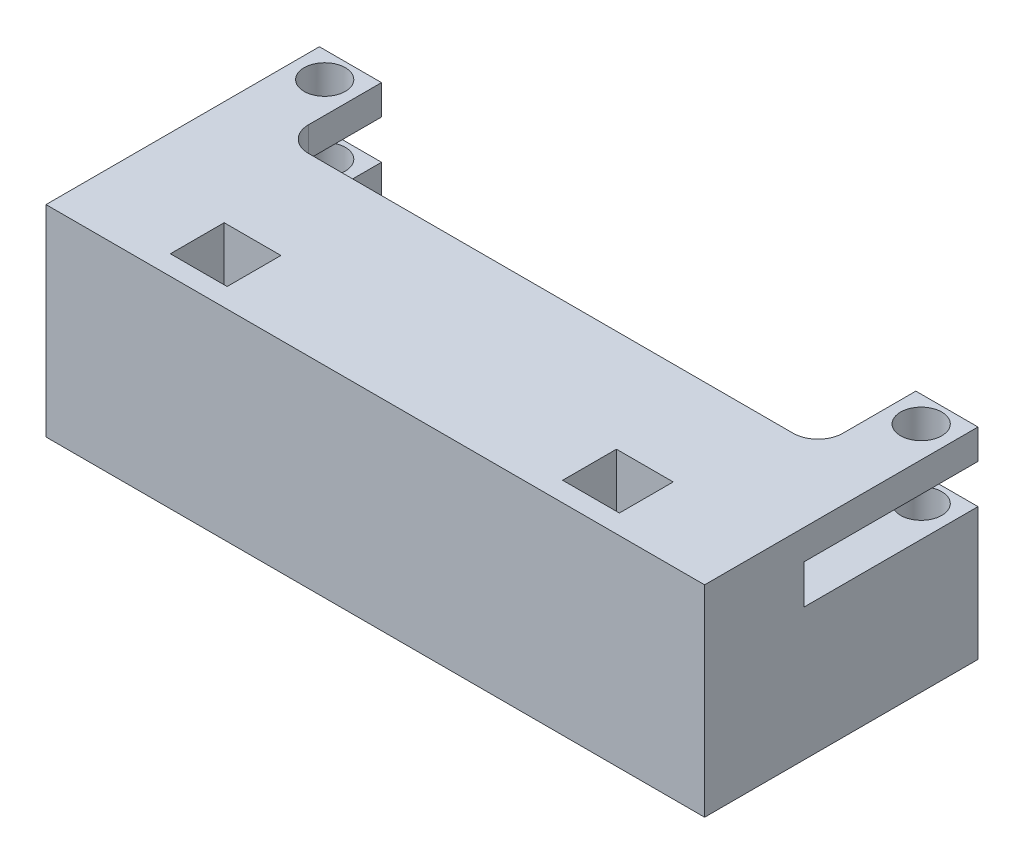
ISO-10303-21;
HEADER;
FILE_DESCRIPTION(('STEP AP214'),'2;1');
FILE_NAME('part.step','',(''),(''),'','','');
FILE_SCHEMA(('AUTOMOTIVE_DESIGN { 1 0 10303 214 1 1 1 1 }'));
ENDSEC;
DATA;
#1=APPLICATION_CONTEXT('core data for automotive mechanical design processes');
#2=APPLICATION_PROTOCOL_DEFINITION('international standard','automotive_design',2000,#1);
#3=PRODUCT_CONTEXT('',#1,'mechanical');
#4=PRODUCT('Part','Part','',(#3));
#5=PRODUCT_RELATED_PRODUCT_CATEGORY('part','',(#4));
#6=PRODUCT_DEFINITION_FORMATION('','',#4);
#7=PRODUCT_DEFINITION_CONTEXT('part definition',#1,'design');
#8=PRODUCT_DEFINITION('design','',#6,#7);
#9=PRODUCT_DEFINITION_SHAPE('','',#8);
#10=(LENGTH_UNIT() NAMED_UNIT(*) SI_UNIT(.MILLI.,.METRE.));
#11=(NAMED_UNIT(*) PLANE_ANGLE_UNIT() SI_UNIT($,.RADIAN.));
#12=(NAMED_UNIT(*) SI_UNIT($,.STERADIAN.) SOLID_ANGLE_UNIT());
#13=UNCERTAINTY_MEASURE_WITH_UNIT(LENGTH_MEASURE(1.E-05),#10,'distance_accuracy_value','');
#14=(GEOMETRIC_REPRESENTATION_CONTEXT(3) GLOBAL_UNCERTAINTY_ASSIGNED_CONTEXT((#13)) GLOBAL_UNIT_ASSIGNED_CONTEXT((#10,
#11,#12)) REPRESENTATION_CONTEXT('',''));
#15=CARTESIAN_POINT('',(0.,0.,0.));
#16=DIRECTION('',(0.,0.,1.));
#17=DIRECTION('',(1.,0.,0.));
#18=AXIS2_PLACEMENT_3D('',#15,#16,#17);
#19=CARTESIAN_POINT('',(33.655,20.574,-13.97));
#20=DIRECTION('',(0.,0.,1.));
#21=DIRECTION('',(1.,0.,0.));
#22=AXIS2_PLACEMENT_3D('',#19,#20,#21);
#23=PLANE('',#22);
#24=DIRECTION('',(-1.,0.,0.));
#25=VECTOR('',#24,1.);
#26=CARTESIAN_POINT('',(33.655,13.526,-13.97));
#27=LINE('',#26,#25);
#28=CARTESIAN_POINT('',(33.655,13.526,-13.97));
#29=VERTEX_POINT('',#28);
#30=CARTESIAN_POINT('',(27.305,13.526,-13.97));
#31=VERTEX_POINT('',#30);
#32=EDGE_CURVE('E411',#29,#31,#27,.T.);
#33=ORIENTED_EDGE('',*,*,#32,.F.);
#34=DIRECTION('',(0.,-1.,0.));
#35=VECTOR('',#34,1.);
#36=CARTESIAN_POINT('',(33.655,20.574,-13.97));
#37=LINE('',#36,#35);
#38=CARTESIAN_POINT('',(33.655,0.,-13.97));
#39=VERTEX_POINT('',#38);
#40=EDGE_CURVE('E447',#29,#39,#37,.T.);
#41=ORIENTED_EDGE('',*,*,#40,.T.);
#42=DIRECTION('',(-1.,0.,0.));
#43=VECTOR('',#42,1.);
#44=CARTESIAN_POINT('',(33.655,0.,-13.97));
#45=LINE('',#44,#43);
#46=CARTESIAN_POINT('',(27.305,0.,-13.97));
#47=VERTEX_POINT('',#46);
#48=EDGE_CURVE('E414',#39,#47,#45,.T.);
#49=ORIENTED_EDGE('',*,*,#48,.T.);
#50=DIRECTION('',(0.,-1.,0.));
#51=VECTOR('',#50,1.);
#52=CARTESIAN_POINT('',(27.305,20.574,-13.97));
#53=LINE('',#52,#51);
#54=EDGE_CURVE('E48',#31,#47,#53,.T.);
#55=ORIENTED_EDGE('',*,*,#54,.F.);
#56=EDGE_LOOP('',(#33,#41,#49,#55));
#57=FACE_BOUND('',#56,.T.);
#58=ADVANCED_FACE('F39',(#57),#23,.F.);
#59=DIRECTION('',(1.,0.,0.));
#60=VECTOR('',#59,1.);
#61=CARTESIAN_POINT('',(33.655,17.526,-13.97));
#62=LINE('',#61,#60);
#63=CARTESIAN_POINT('',(27.305,17.526,-13.97));
#64=VERTEX_POINT('',#63);
#65=CARTESIAN_POINT('',(33.655,17.526,-13.97));
#66=VERTEX_POINT('',#65);
#67=EDGE_CURVE('E390',#64,#66,#62,.T.);
#68=ORIENTED_EDGE('',*,*,#67,.F.);
#69=CARTESIAN_POINT('',(27.305,20.574,-13.97));
#70=VERTEX_POINT('',#69);
#71=EDGE_CURVE('E11',#70,#64,#53,.T.);
#72=ORIENTED_EDGE('',*,*,#71,.F.);
#73=DIRECTION('',(-1.,0.,0.));
#74=VECTOR('',#73,1.);
#75=CARTESIAN_POINT('',(33.655,20.574,-13.97));
#76=LINE('',#75,#74);
#77=CARTESIAN_POINT('',(33.655,20.574,-13.97));
#78=VERTEX_POINT('',#77);
#79=EDGE_CURVE('E415',#78,#70,#76,.T.);
#80=ORIENTED_EDGE('',*,*,#79,.F.);
#81=EDGE_CURVE('E484',#78,#66,#37,.T.);
#82=ORIENTED_EDGE('',*,*,#81,.T.);
#83=EDGE_LOOP('',(#68,#72,#80,#82));
#84=FACE_BOUND('',#83,.T.);
#85=ADVANCED_FACE('F551',(#84),#23,.F.);
#86=CARTESIAN_POINT('',(27.305,20.574,-6.51000000000001));
#87=DIRECTION('',(1.,0.,0.));
#88=DIRECTION('',(0.,0.,-1.));
#89=AXIS2_PLACEMENT_3D('',#86,#87,#88);
#90=PLANE('',#89);
#91=DIRECTION('',(0.,0.,1.));
#92=VECTOR('',#91,1.);
#93=CARTESIAN_POINT('',(27.305,13.526,-6.51000000000001));
#94=LINE('',#93,#92);
#95=CARTESIAN_POINT('',(27.305,13.526,-6.51000000000001));
#96=VERTEX_POINT('',#95);
#97=EDGE_CURVE('E408',#31,#96,#94,.T.);
#98=ORIENTED_EDGE('',*,*,#97,.F.);
#99=ORIENTED_EDGE('',*,*,#54,.T.);
#100=DIRECTION('',(0.,0.,1.));
#101=VECTOR('',#100,1.);
#102=CARTESIAN_POINT('',(27.305,0.,-6.51000000000001));
#103=LINE('',#102,#101);
#104=CARTESIAN_POINT('',(27.305,0.,-6.51000000000001));
#105=VERTEX_POINT('',#104);
#106=EDGE_CURVE('E451',#47,#105,#103,.T.);
#107=ORIENTED_EDGE('',*,*,#106,.T.);
#108=DIRECTION('',(0.,-1.,0.));
#109=VECTOR('',#108,1.);
#110=CARTESIAN_POINT('',(27.305,20.574,-6.51000000000001));
#111=LINE('',#110,#109);
#112=EDGE_CURVE('E521',#96,#105,#111,.T.);
#113=ORIENTED_EDGE('',*,*,#112,.F.);
#114=EDGE_LOOP('',(#98,#99,#107,#113));
#115=FACE_BOUND('',#114,.T.);
#116=ADVANCED_FACE('F601',(#115),#90,.F.);
#117=DIRECTION('',(0.,0.,-1.));
#118=VECTOR('',#117,1.);
#119=CARTESIAN_POINT('',(27.305,17.526,-6.51000000000001));
#120=LINE('',#119,#118);
#121=CARTESIAN_POINT('',(27.305,17.526,-6.51000000000001));
#122=VERTEX_POINT('',#121);
#123=EDGE_CURVE('E387',#122,#64,#120,.T.);
#124=ORIENTED_EDGE('',*,*,#123,.F.);
#125=CARTESIAN_POINT('',(27.305,20.574,-6.51000000000001));
#126=VERTEX_POINT('',#125);
#127=EDGE_CURVE('E522',#126,#122,#111,.T.);
#128=ORIENTED_EDGE('',*,*,#127,.F.);
#129=DIRECTION('',(0.,0.,1.));
#130=VECTOR('',#129,1.);
#131=CARTESIAN_POINT('',(27.305,20.574,-6.51000000000001));
#132=LINE('',#131,#130);
#133=EDGE_CURVE('E419',#70,#126,#132,.T.);
#134=ORIENTED_EDGE('',*,*,#133,.F.);
#135=ORIENTED_EDGE('',*,*,#71,.T.);
#136=EDGE_LOOP('',(#124,#128,#134,#135));
#137=FACE_BOUND('',#136,.T.);
#138=ADVANCED_FACE('F605',(#137),#90,.F.);
#139=CARTESIAN_POINT('',(24.765,20.574,-6.51000000000001));
#140=DIRECTION('',(0.,-1.,0.));
#141=DIRECTION('',(0.,0.,-1.));
#142=AXIS2_PLACEMENT_3D('',#139,#140,#141);
#143=CYLINDRICAL_SURFACE('',#142,2.54);
#144=CARTESIAN_POINT('',(24.765,13.526,-6.51000000000001));
#145=DIRECTION('',(0.,1.,0.));
#146=DIRECTION('',(0.,0.,1.));
#147=AXIS2_PLACEMENT_3D('',#144,#145,#146);
#148=CIRCLE('',#147,2.54);
#149=CARTESIAN_POINT('',(24.765,13.526,-3.97));
#150=VERTEX_POINT('',#149);
#151=EDGE_CURVE('E405',#96,#150,#148,.F.);
#152=ORIENTED_EDGE('',*,*,#151,.F.);
#153=ORIENTED_EDGE('',*,*,#112,.T.);
#154=CARTESIAN_POINT('',(24.765,0.,-6.51000000000001));
#155=DIRECTION('',(0.,-1.,0.));
#156=DIRECTION('',(0.,0.,1.));
#157=AXIS2_PLACEMENT_3D('',#154,#155,#156);
#158=CIRCLE('',#157,2.54);
#159=CARTESIAN_POINT('',(24.765,0.,-3.97));
#160=VERTEX_POINT('',#159);
#161=EDGE_CURVE('E455',#105,#160,#158,.T.);
#162=ORIENTED_EDGE('',*,*,#161,.T.);
#163=DIRECTION('',(0.,-1.,0.));
#164=VECTOR('',#163,1.);
#165=CARTESIAN_POINT('',(24.765,20.574,-3.97));
#166=LINE('',#165,#164);
#167=EDGE_CURVE('E516',#150,#160,#166,.T.);
#168=ORIENTED_EDGE('',*,*,#167,.F.);
#169=EDGE_LOOP('',(#152,#153,#162,#168));
#170=FACE_BOUND('',#169,.T.);
#171=ADVANCED_FACE('F610',(#170),#143,.F.);
#172=CARTESIAN_POINT('',(24.765,17.526,-6.51000000000001));
#173=DIRECTION('',(0.,-1.,0.));
#174=DIRECTION('',(0.,0.,-1.));
#175=AXIS2_PLACEMENT_3D('',#172,#173,#174);
#176=CIRCLE('',#175,2.54);
#177=CARTESIAN_POINT('',(24.765,17.526,-3.97));
#178=VERTEX_POINT('',#177);
#179=EDGE_CURVE('E384',#178,#122,#176,.F.);
#180=ORIENTED_EDGE('',*,*,#179,.F.);
#181=CARTESIAN_POINT('',(24.765,20.574,-3.97));
#182=VERTEX_POINT('',#181);
#183=EDGE_CURVE('E517',#182,#178,#166,.T.);
#184=ORIENTED_EDGE('',*,*,#183,.F.);
#185=CARTESIAN_POINT('',(24.765,20.574,-6.51000000000001));
#186=DIRECTION('',(0.,-1.,0.));
#187=DIRECTION('',(0.,0.,1.));
#188=AXIS2_PLACEMENT_3D('',#185,#186,#187);
#189=CIRCLE('',#188,2.54);
#190=EDGE_CURVE('E423',#126,#182,#189,.T.);
#191=ORIENTED_EDGE('',*,*,#190,.F.);
#192=ORIENTED_EDGE('',*,*,#127,.T.);
#193=EDGE_LOOP('',(#180,#184,#191,#192));
#194=FACE_BOUND('',#193,.T.);
#195=ADVANCED_FACE('F616',(#194),#143,.F.);
#196=CARTESIAN_POINT('',(-24.765,20.574,-3.97));
#197=DIRECTION('',(0.,0.,1.));
#198=DIRECTION('',(1.,0.,0.));
#199=AXIS2_PLACEMENT_3D('',#196,#197,#198);
#200=PLANE('',#199);
#201=DIRECTION('',(-1.,0.,0.));
#202=VECTOR('',#201,1.);
#203=CARTESIAN_POINT('',(-24.765,13.526,-3.97));
#204=LINE('',#203,#202);
#205=CARTESIAN_POINT('',(-24.765,13.526,-3.97));
#206=VERTEX_POINT('',#205);
#207=EDGE_CURVE('E402',#150,#206,#204,.T.);
#208=ORIENTED_EDGE('',*,*,#207,.F.);
#209=ORIENTED_EDGE('',*,*,#167,.T.);
#210=DIRECTION('',(-1.,0.,0.));
#211=VECTOR('',#210,1.);
#212=CARTESIAN_POINT('',(-24.765,0.,-3.97));
#213=LINE('',#212,#211);
#214=CARTESIAN_POINT('',(-24.765,0.,-3.97));
#215=VERTEX_POINT('',#214);
#216=EDGE_CURVE('E459',#160,#215,#213,.T.);
#217=ORIENTED_EDGE('',*,*,#216,.T.);
#218=DIRECTION('',(0.,-1.,0.));
#219=VECTOR('',#218,1.);
#220=CARTESIAN_POINT('',(-24.765,20.574,-3.97));
#221=LINE('',#220,#219);
#222=EDGE_CURVE('E511',#206,#215,#221,.T.);
#223=ORIENTED_EDGE('',*,*,#222,.F.);
#224=EDGE_LOOP('',(#208,#209,#217,#223));
#225=FACE_BOUND('',#224,.T.);
#226=ADVANCED_FACE('F618',(#225),#200,.F.);
#227=DIRECTION('',(1.,0.,0.));
#228=VECTOR('',#227,1.);
#229=CARTESIAN_POINT('',(-24.765,17.526,-3.97));
#230=LINE('',#229,#228);
#231=CARTESIAN_POINT('',(-24.765,17.526,-3.97));
#232=VERTEX_POINT('',#231);
#233=EDGE_CURVE('E381',#232,#178,#230,.T.);
#234=ORIENTED_EDGE('',*,*,#233,.F.);
#235=CARTESIAN_POINT('',(-24.765,20.574,-3.97));
#236=VERTEX_POINT('',#235);
#237=EDGE_CURVE('E512',#236,#232,#221,.T.);
#238=ORIENTED_EDGE('',*,*,#237,.F.);
#239=DIRECTION('',(-1.,0.,0.));
#240=VECTOR('',#239,1.);
#241=CARTESIAN_POINT('',(-24.765,20.574,-3.97));
#242=LINE('',#241,#240);
#243=EDGE_CURVE('E426',#182,#236,#242,.T.);
#244=ORIENTED_EDGE('',*,*,#243,.F.);
#245=ORIENTED_EDGE('',*,*,#183,.T.);
#246=EDGE_LOOP('',(#234,#238,#244,#245));
#247=FACE_BOUND('',#246,.T.);
#248=ADVANCED_FACE('F621',(#247),#200,.F.);
#249=CARTESIAN_POINT('',(-24.765,20.574,-6.51000000000001));
#250=DIRECTION('',(0.,-1.,0.));
#251=DIRECTION('',(0.,0.,-1.));
#252=AXIS2_PLACEMENT_3D('',#249,#250,#251);
#253=CYLINDRICAL_SURFACE('',#252,2.54);
#254=CARTESIAN_POINT('',(-24.765,13.526,-6.51000000000001));
#255=DIRECTION('',(0.,1.,0.));
#256=DIRECTION('',(0.,0.,1.));
#257=AXIS2_PLACEMENT_3D('',#254,#255,#256);
#258=CIRCLE('',#257,2.54);
#259=CARTESIAN_POINT('',(-27.305,13.526,-6.51000000000001));
#260=VERTEX_POINT('',#259);
#261=EDGE_CURVE('E399',#206,#260,#258,.F.);
#262=ORIENTED_EDGE('',*,*,#261,.F.);
#263=ORIENTED_EDGE('',*,*,#222,.T.);
#264=CARTESIAN_POINT('',(-24.765,0.,-6.51000000000001));
#265=DIRECTION('',(0.,-1.,0.));
#266=DIRECTION('',(0.,0.,1.));
#267=AXIS2_PLACEMENT_3D('',#264,#265,#266);
#268=CIRCLE('',#267,2.54);
#269=CARTESIAN_POINT('',(-27.305,0.,-6.51000000000001));
#270=VERTEX_POINT('',#269);
#271=EDGE_CURVE('E463',#215,#270,#268,.T.);
#272=ORIENTED_EDGE('',*,*,#271,.T.);
#273=DIRECTION('',(0.,-1.,0.));
#274=VECTOR('',#273,1.);
#275=CARTESIAN_POINT('',(-27.305,20.574,-6.51000000000001));
#276=LINE('',#275,#274);
#277=EDGE_CURVE('E506',#260,#270,#276,.T.);
#278=ORIENTED_EDGE('',*,*,#277,.F.);
#279=EDGE_LOOP('',(#262,#263,#272,#278));
#280=FACE_BOUND('',#279,.T.);
#281=ADVANCED_FACE('F623',(#280),#253,.F.);
#282=CARTESIAN_POINT('',(-24.765,17.526,-6.51000000000001));
#283=DIRECTION('',(0.,-1.,0.));
#284=DIRECTION('',(0.,0.,-1.));
#285=AXIS2_PLACEMENT_3D('',#282,#283,#284);
#286=CIRCLE('',#285,2.54);
#287=CARTESIAN_POINT('',(-27.305,17.526,-6.51000000000001));
#288=VERTEX_POINT('',#287);
#289=EDGE_CURVE('E378',#288,#232,#286,.F.);
#290=ORIENTED_EDGE('',*,*,#289,.F.);
#291=CARTESIAN_POINT('',(-27.305,20.574,-6.51000000000001));
#292=VERTEX_POINT('',#291);
#293=EDGE_CURVE('E507',#292,#288,#276,.T.);
#294=ORIENTED_EDGE('',*,*,#293,.F.);
#295=CARTESIAN_POINT('',(-24.765,20.574,-6.51000000000001));
#296=DIRECTION('',(0.,-1.,0.));
#297=DIRECTION('',(0.,0.,1.));
#298=AXIS2_PLACEMENT_3D('',#295,#296,#297);
#299=CIRCLE('',#298,2.54);
#300=EDGE_CURVE('E429',#236,#292,#299,.T.);
#301=ORIENTED_EDGE('',*,*,#300,.F.);
#302=ORIENTED_EDGE('',*,*,#237,.T.);
#303=EDGE_LOOP('',(#290,#294,#301,#302));
#304=FACE_BOUND('',#303,.T.);
#305=ADVANCED_FACE('F626',(#304),#253,.F.);
#306=CARTESIAN_POINT('',(-27.305,20.574,-13.97));
#307=DIRECTION('',(-1.,0.,0.));
#308=DIRECTION('',(0.,0.,1.));
#309=AXIS2_PLACEMENT_3D('',#306,#307,#308);
#310=PLANE('',#309);
#311=DIRECTION('',(0.,0.,-1.));
#312=VECTOR('',#311,1.);
#313=CARTESIAN_POINT('',(-27.305,13.526,-13.97));
#314=LINE('',#313,#312);
#315=CARTESIAN_POINT('',(-27.305,13.526,-13.97));
#316=VERTEX_POINT('',#315);
#317=EDGE_CURVE('E396',#260,#316,#314,.T.);
#318=ORIENTED_EDGE('',*,*,#317,.F.);
#319=ORIENTED_EDGE('',*,*,#277,.T.);
#320=DIRECTION('',(0.,0.,-1.));
#321=VECTOR('',#320,1.);
#322=CARTESIAN_POINT('',(-27.305,0.,-13.97));
#323=LINE('',#322,#321);
#324=CARTESIAN_POINT('',(-27.305,0.,-13.97));
#325=VERTEX_POINT('',#324);
#326=EDGE_CURVE('E467',#270,#325,#323,.T.);
#327=ORIENTED_EDGE('',*,*,#326,.T.);
#328=DIRECTION('',(0.,-1.,0.));
#329=VECTOR('',#328,1.);
#330=CARTESIAN_POINT('',(-27.305,20.574,-13.97));
#331=LINE('',#330,#329);
#332=EDGE_CURVE('E501',#316,#325,#331,.T.);
#333=ORIENTED_EDGE('',*,*,#332,.F.);
#334=EDGE_LOOP('',(#318,#319,#327,#333));
#335=FACE_BOUND('',#334,.T.);
#336=ADVANCED_FACE('F628',(#335),#310,.F.);
#337=DIRECTION('',(0.,0.,1.));
#338=VECTOR('',#337,1.);
#339=CARTESIAN_POINT('',(-27.305,17.526,-13.97));
#340=LINE('',#339,#338);
#341=CARTESIAN_POINT('',(-27.305,17.526,-13.97));
#342=VERTEX_POINT('',#341);
#343=EDGE_CURVE('E375',#342,#288,#340,.T.);
#344=ORIENTED_EDGE('',*,*,#343,.F.);
#345=CARTESIAN_POINT('',(-27.305,20.574,-13.97));
#346=VERTEX_POINT('',#345);
#347=EDGE_CURVE('E502',#346,#342,#331,.T.);
#348=ORIENTED_EDGE('',*,*,#347,.F.);
#349=DIRECTION('',(0.,0.,-1.));
#350=VECTOR('',#349,1.);
#351=CARTESIAN_POINT('',(-27.305,20.574,-13.97));
#352=LINE('',#351,#350);
#353=EDGE_CURVE('E432',#292,#346,#352,.T.);
#354=ORIENTED_EDGE('',*,*,#353,.F.);
#355=ORIENTED_EDGE('',*,*,#293,.T.);
#356=EDGE_LOOP('',(#344,#348,#354,#355));
#357=FACE_BOUND('',#356,.T.);
#358=ADVANCED_FACE('F631',(#357),#310,.F.);
#359=CARTESIAN_POINT('',(-33.655,20.574,-13.97));
#360=DIRECTION('',(0.,0.,1.));
#361=DIRECTION('',(1.,0.,0.));
#362=AXIS2_PLACEMENT_3D('',#359,#360,#361);
#363=PLANE('',#362);
#364=DIRECTION('',(-1.,0.,0.));
#365=VECTOR('',#364,1.);
#366=CARTESIAN_POINT('',(-33.655,13.526,-13.97));
#367=LINE('',#366,#365);
#368=CARTESIAN_POINT('',(-33.655,13.526,-13.97));
#369=VERTEX_POINT('',#368);
#370=EDGE_CURVE('E393',#316,#369,#367,.T.);
#371=ORIENTED_EDGE('',*,*,#370,.F.);
#372=ORIENTED_EDGE('',*,*,#332,.T.);
#373=DIRECTION('',(-1.,0.,0.));
#374=VECTOR('',#373,1.);
#375=CARTESIAN_POINT('',(-33.655,0.,-13.97));
#376=LINE('',#375,#374);
#377=CARTESIAN_POINT('',(-33.655,0.,-13.97));
#378=VERTEX_POINT('',#377);
#379=EDGE_CURVE('E471',#325,#378,#376,.T.);
#380=ORIENTED_EDGE('',*,*,#379,.T.);
#381=DIRECTION('',(0.,-1.,0.));
#382=VECTOR('',#381,1.);
#383=CARTESIAN_POINT('',(-33.655,20.574,-13.97));
#384=LINE('',#383,#382);
#385=EDGE_CURVE('E496',#369,#378,#384,.T.);
#386=ORIENTED_EDGE('',*,*,#385,.F.);
#387=EDGE_LOOP('',(#371,#372,#380,#386));
#388=FACE_BOUND('',#387,.T.);
#389=ADVANCED_FACE('F633',(#388),#363,.F.);
#390=DIRECTION('',(1.,0.,0.));
#391=VECTOR('',#390,1.);
#392=CARTESIAN_POINT('',(-33.655,17.526,-13.97));
#393=LINE('',#392,#391);
#394=CARTESIAN_POINT('',(-33.655,17.526,-13.97));
#395=VERTEX_POINT('',#394);
#396=EDGE_CURVE('E372',#395,#342,#393,.T.);
#397=ORIENTED_EDGE('',*,*,#396,.F.);
#398=CARTESIAN_POINT('',(-33.655,20.574,-13.97));
#399=VERTEX_POINT('',#398);
#400=EDGE_CURVE('E497',#399,#395,#384,.T.);
#401=ORIENTED_EDGE('',*,*,#400,.F.);
#402=DIRECTION('',(-1.,0.,0.));
#403=VECTOR('',#402,1.);
#404=CARTESIAN_POINT('',(-33.655,20.574,-13.97));
#405=LINE('',#404,#403);
#406=EDGE_CURVE('E435',#346,#399,#405,.T.);
#407=ORIENTED_EDGE('',*,*,#406,.F.);
#408=ORIENTED_EDGE('',*,*,#347,.T.);
#409=EDGE_LOOP('',(#397,#401,#407,#408));
#410=FACE_BOUND('',#409,.T.);
#411=ADVANCED_FACE('F636',(#410),#363,.F.);
#412=CARTESIAN_POINT('',(-33.655,20.574,13.97));
#413=DIRECTION('',(1.,0.,0.));
#414=DIRECTION('',(0.,0.,-1.));
#415=AXIS2_PLACEMENT_3D('',#412,#413,#414);
#416=PLANE('',#415);
#417=DIRECTION('',(0.,0.,-1.));
#418=VECTOR('',#417,1.);
#419=CARTESIAN_POINT('',(-33.655,13.526,3.81));
#420=LINE('',#419,#418);
#421=CARTESIAN_POINT('',(-33.655,13.526,3.81));
#422=VERTEX_POINT('',#421);
#423=EDGE_CURVE('E368',#422,#369,#420,.T.);
#424=ORIENTED_EDGE('',*,*,#423,.T.);
#425=ORIENTED_EDGE('',*,*,#385,.T.);
#426=DIRECTION('',(0.,0.,1.));
#427=VECTOR('',#426,1.);
#428=CARTESIAN_POINT('',(-33.655,0.,13.97));
#429=LINE('',#428,#427);
#430=CARTESIAN_POINT('',(-33.655,0.,13.97));
#431=VERTEX_POINT('',#430);
#432=EDGE_CURVE('E475',#378,#431,#429,.T.);
#433=ORIENTED_EDGE('',*,*,#432,.T.);
#434=DIRECTION('',(0.,-1.,0.));
#435=VECTOR('',#434,1.);
#436=CARTESIAN_POINT('',(-33.655,20.574,13.97));
#437=LINE('',#436,#435);
#438=CARTESIAN_POINT('',(-33.655,20.574,13.97));
#439=VERTEX_POINT('',#438);
#440=EDGE_CURVE('E492',#439,#431,#437,.T.);
#441=ORIENTED_EDGE('',*,*,#440,.F.);
#442=DIRECTION('',(0.,0.,1.));
#443=VECTOR('',#442,1.);
#444=CARTESIAN_POINT('',(-33.655,20.574,13.97));
#445=LINE('',#444,#443);
#446=EDGE_CURVE('E438',#399,#439,#445,.T.);
#447=ORIENTED_EDGE('',*,*,#446,.F.);
#448=ORIENTED_EDGE('',*,*,#400,.T.);
#449=DIRECTION('',(0.,0.,-1.));
#450=VECTOR('',#449,1.);
#451=CARTESIAN_POINT('',(-33.655,17.526,3.81));
#452=LINE('',#451,#450);
#453=CARTESIAN_POINT('',(-33.655,17.526,3.81));
#454=VERTEX_POINT('',#453);
#455=EDGE_CURVE('E358',#454,#395,#452,.T.);
#456=ORIENTED_EDGE('',*,*,#455,.F.);
#457=DIRECTION('',(0.,-1.,0.));
#458=VECTOR('',#457,1.);
#459=CARTESIAN_POINT('',(-33.655,13.526,3.81));
#460=LINE('',#459,#458);
#461=EDGE_CURVE('E344',#454,#422,#460,.T.);
#462=ORIENTED_EDGE('',*,*,#461,.T.);
#463=EDGE_LOOP('',(#424,#425,#433,#441,#447,#448,#456,#462));
#464=FACE_BOUND('',#463,.T.);
#465=ADVANCED_FACE('F638',(#464),#416,.F.);
#466=CARTESIAN_POINT('',(33.655,20.574,13.97));
#467=DIRECTION('',(-1.,0.,0.));
#468=DIRECTION('',(0.,0.,1.));
#469=AXIS2_PLACEMENT_3D('',#466,#467,#468);
#470=PLANE('',#469);
#471=DIRECTION('',(0.,0.,-1.));
#472=VECTOR('',#471,1.);
#473=CARTESIAN_POINT('',(33.655,13.526,3.81));
#474=LINE('',#473,#472);
#475=CARTESIAN_POINT('',(33.655,13.526,3.81));
#476=VERTEX_POINT('',#475);
#477=EDGE_CURVE('E365',#476,#29,#474,.T.);
#478=ORIENTED_EDGE('',*,*,#477,.F.);
#479=DIRECTION('',(0.,1.,0.));
#480=VECTOR('',#479,1.);
#481=CARTESIAN_POINT('',(33.655,13.526,3.81));
#482=LINE('',#481,#480);
#483=CARTESIAN_POINT('',(33.655,17.526,3.81));
#484=VERTEX_POINT('',#483);
#485=EDGE_CURVE('E351',#476,#484,#482,.T.);
#486=ORIENTED_EDGE('',*,*,#485,.T.);
#487=DIRECTION('',(0.,0.,-1.));
#488=VECTOR('',#487,1.);
#489=CARTESIAN_POINT('',(33.655,17.526,3.81));
#490=LINE('',#489,#488);
#491=EDGE_CURVE('E361',#484,#66,#490,.T.);
#492=ORIENTED_EDGE('',*,*,#491,.T.);
#493=ORIENTED_EDGE('',*,*,#81,.F.);
#494=DIRECTION('',(0.,0.,-1.));
#495=VECTOR('',#494,1.);
#496=CARTESIAN_POINT('',(33.655,20.574,13.97));
#497=LINE('',#496,#495);
#498=CARTESIAN_POINT('',(33.655,20.574,13.97));
#499=VERTEX_POINT('',#498);
#500=EDGE_CURVE('E444',#499,#78,#497,.T.);
#501=ORIENTED_EDGE('',*,*,#500,.F.);
#502=DIRECTION('',(0.,-1.,0.));
#503=VECTOR('',#502,1.);
#504=CARTESIAN_POINT('',(33.655,20.574,13.97));
#505=LINE('',#504,#503);
#506=CARTESIAN_POINT('',(33.655,0.,13.97));
#507=VERTEX_POINT('',#506);
#508=EDGE_CURVE('E488',#499,#507,#505,.T.);
#509=ORIENTED_EDGE('',*,*,#508,.T.);
#510=DIRECTION('',(0.,0.,-1.));
#511=VECTOR('',#510,1.);
#512=CARTESIAN_POINT('',(33.655,0.,13.97));
#513=LINE('',#512,#511);
#514=EDGE_CURVE('E420',#507,#39,#513,.T.);
#515=ORIENTED_EDGE('',*,*,#514,.T.);
#516=ORIENTED_EDGE('',*,*,#40,.F.);
#517=EDGE_LOOP('',(#478,#486,#492,#493,#501,#509,#515,#516));
#518=FACE_BOUND('',#517,.T.);
#519=ADVANCED_FACE('F547',(#518),#470,.F.);
#520=CARTESIAN_POINT('',(-33.655,20.574,13.97));
#521=DIRECTION('',(0.,0.,-1.));
#522=DIRECTION('',(-1.,0.,0.));
#523=AXIS2_PLACEMENT_3D('',#520,#521,#522);
#524=PLANE('',#523);
#525=DIRECTION('',(1.,0.,0.));
#526=VECTOR('',#525,1.);
#527=CARTESIAN_POINT('',(-33.655,0.,13.97));
#528=LINE('',#527,#526);
#529=EDGE_CURVE('E478',#431,#507,#528,.T.);
#530=ORIENTED_EDGE('',*,*,#529,.T.);
#531=ORIENTED_EDGE('',*,*,#508,.F.);
#532=DIRECTION('',(1.,0.,0.));
#533=VECTOR('',#532,1.);
#534=CARTESIAN_POINT('',(-33.655,20.574,13.97));
#535=LINE('',#534,#533);
#536=EDGE_CURVE('E441',#439,#499,#535,.T.);
#537=ORIENTED_EDGE('',*,*,#536,.F.);
#538=ORIENTED_EDGE('',*,*,#440,.T.);
#539=EDGE_LOOP('',(#530,#531,#537,#538));
#540=FACE_BOUND('',#539,.T.);
#541=ADVANCED_FACE('F584',(#540),#524,.F.);
#542=CARTESIAN_POINT('',(24.765,20.574,-6.51000000000001));
#543=DIRECTION('',(0.,1.,0.));
#544=DIRECTION('',(0.,0.,1.));
#545=AXIS2_PLACEMENT_3D('',#542,#543,#544);
#546=PLANE('',#545);
#547=DIRECTION('',(1.,0.,0.));
#548=VECTOR('',#547,1.);
#549=CARTESIAN_POINT('',(17.145,20.574,11.97));
#550=LINE('',#549,#548);
#551=CARTESIAN_POINT('',(17.145,20.574,11.97));
#552=VERTEX_POINT('',#551);
#553=CARTESIAN_POINT('',(22.945,20.574,11.97));
#554=VERTEX_POINT('',#553);
#555=EDGE_CURVE('E56',#552,#554,#550,.T.);
#556=ORIENTED_EDGE('',*,*,#555,.F.);
#557=DIRECTION('',(0.,0.,1.));
#558=VECTOR('',#557,1.);
#559=CARTESIAN_POINT('',(17.145,20.574,11.97));
#560=LINE('',#559,#558);
#561=CARTESIAN_POINT('',(17.145,20.574,6.46999999999999));
#562=VERTEX_POINT('',#561);
#563=EDGE_CURVE('E250',#562,#552,#560,.T.);
#564=ORIENTED_EDGE('',*,*,#563,.F.);
#565=DIRECTION('',(-1.,0.,0.));
#566=VECTOR('',#565,1.);
#567=CARTESIAN_POINT('',(17.145,20.574,6.46999999999999));
#568=LINE('',#567,#566);
#569=CARTESIAN_POINT('',(22.945,20.574,6.46999999999999));
#570=VERTEX_POINT('',#569);
#571=EDGE_CURVE('E254',#570,#562,#568,.T.);
#572=ORIENTED_EDGE('',*,*,#571,.F.);
#573=DIRECTION('',(0.,0.,-1.));
#574=VECTOR('',#573,1.);
#575=CARTESIAN_POINT('',(22.945,20.574,11.97));
#576=LINE('',#575,#574);
#577=EDGE_CURVE('E263',#554,#570,#576,.T.);
#578=ORIENTED_EDGE('',*,*,#577,.F.);
#579=EDGE_LOOP('',(#556,#564,#572,#578));
#580=FACE_BOUND('',#579,.T.);
#581=DIRECTION('',(1.,0.,0.));
#582=VECTOR('',#581,1.);
#583=CARTESIAN_POINT('',(-22.945,20.574,11.97));
#584=LINE('',#583,#582);
#585=CARTESIAN_POINT('',(-22.945,20.574,11.97));
#586=VERTEX_POINT('',#585);
#587=CARTESIAN_POINT('',(-17.145,20.574,11.97));
#588=VERTEX_POINT('',#587);
#589=EDGE_CURVE('E64',#586,#588,#584,.T.);
#590=ORIENTED_EDGE('',*,*,#589,.F.);
#591=DIRECTION('',(0.,0.,1.));
#592=VECTOR('',#591,1.);
#593=CARTESIAN_POINT('',(-22.945,20.574,11.97));
#594=LINE('',#593,#592);
#595=CARTESIAN_POINT('',(-22.945,20.574,6.47));
#596=VERTEX_POINT('',#595);
#597=EDGE_CURVE('E284',#596,#586,#594,.T.);
#598=ORIENTED_EDGE('',*,*,#597,.F.);
#599=DIRECTION('',(-1.,0.,0.));
#600=VECTOR('',#599,1.);
#601=CARTESIAN_POINT('',(-22.945,20.574,6.47));
#602=LINE('',#601,#600);
#603=CARTESIAN_POINT('',(-17.145,20.574,6.47));
#604=VERTEX_POINT('',#603);
#605=EDGE_CURVE('E303',#604,#596,#602,.T.);
#606=ORIENTED_EDGE('',*,*,#605,.F.);
#607=DIRECTION('',(0.,0.,-1.));
#608=VECTOR('',#607,1.);
#609=CARTESIAN_POINT('',(-17.145,20.574,11.97));
#610=LINE('',#609,#608);
#611=EDGE_CURVE('E299',#588,#604,#610,.T.);
#612=ORIENTED_EDGE('',*,*,#611,.F.);
#613=EDGE_LOOP('',(#590,#598,#606,#612));
#614=FACE_BOUND('',#613,.T.);
#615=CARTESIAN_POINT('',(-30.48,20.574,-11.3377238292012));
#616=DIRECTION('',(0.,1.,0.));
#617=DIRECTION('',(0.,0.,1.));
#618=AXIS2_PLACEMENT_3D('',#615,#616,#617);
#619=CIRCLE('',#618,2.10557728256592);
#620=CARTESIAN_POINT('',(-30.48,20.574,-9.23214654663526));
#621=VERTEX_POINT('',#620);
#622=EDGE_CURVE('E325',#621,#621,#619,.T.);
#623=ORIENTED_EDGE('',*,*,#622,.F.);
#624=EDGE_LOOP('',(#623));
#625=FACE_BOUND('',#624,.T.);
#626=CARTESIAN_POINT('',(30.48,20.574,-11.3377238292012));
#627=DIRECTION('',(0.,1.,0.));
#628=DIRECTION('',(0.,0.,-1.));
#629=AXIS2_PLACEMENT_3D('',#626,#627,#628);
#630=CIRCLE('',#629,2.10557728256592);
#631=CARTESIAN_POINT('',(30.48,20.574,-13.4433011117671));
#632=VERTEX_POINT('',#631);
#633=EDGE_CURVE('E273',#632,#632,#630,.T.);
#634=ORIENTED_EDGE('',*,*,#633,.F.);
#635=EDGE_LOOP('',(#634));
#636=FACE_BOUND('',#635,.T.);
#637=ORIENTED_EDGE('',*,*,#79,.T.);
#638=ORIENTED_EDGE('',*,*,#133,.T.);
#639=ORIENTED_EDGE('',*,*,#190,.T.);
#640=ORIENTED_EDGE('',*,*,#243,.T.);
#641=ORIENTED_EDGE('',*,*,#300,.T.);
#642=ORIENTED_EDGE('',*,*,#353,.T.);
#643=ORIENTED_EDGE('',*,*,#406,.T.);
#644=ORIENTED_EDGE('',*,*,#446,.T.);
#645=ORIENTED_EDGE('',*,*,#536,.T.);
#646=ORIENTED_EDGE('',*,*,#500,.T.);
#647=EDGE_LOOP('',(#637,#638,#639,#640,#641,#642,#643,#644,#645,#646));
#648=FACE_BOUND('',#647,.T.);
#649=ADVANCED_FACE('F553',(#580,#614,#625,#636,#648),#546,.T.);
#650=CARTESIAN_POINT('',(24.765,0.,-6.51000000000001));
#651=DIRECTION('',(0.,1.,0.));
#652=DIRECTION('',(0.,0.,1.));
#653=AXIS2_PLACEMENT_3D('',#650,#651,#652);
#654=PLANE('',#653);
#655=DIRECTION('',(0.,0.,1.));
#656=VECTOR('',#655,1.);
#657=CARTESIAN_POINT('',(17.145,0.,11.97));
#658=LINE('',#657,#656);
#659=CARTESIAN_POINT('',(17.145,0.,6.46999999999999));
#660=VERTEX_POINT('',#659);
#661=CARTESIAN_POINT('',(17.145,0.,11.97));
#662=VERTEX_POINT('',#661);
#663=EDGE_CURVE('E235',#660,#662,#658,.T.);
#664=ORIENTED_EDGE('',*,*,#663,.T.);
#665=DIRECTION('',(1.,0.,0.));
#666=VECTOR('',#665,1.);
#667=CARTESIAN_POINT('',(17.145,0.,11.97));
#668=LINE('',#667,#666);
#669=CARTESIAN_POINT('',(22.945,0.,11.97));
#670=VERTEX_POINT('',#669);
#671=EDGE_CURVE('E228',#662,#670,#668,.T.);
#672=ORIENTED_EDGE('',*,*,#671,.T.);
#673=DIRECTION('',(0.,0.,-1.));
#674=VECTOR('',#673,1.);
#675=CARTESIAN_POINT('',(22.945,0.,11.97));
#676=LINE('',#675,#674);
#677=CARTESIAN_POINT('',(22.945,0.,6.46999999999999));
#678=VERTEX_POINT('',#677);
#679=EDGE_CURVE('E239',#670,#678,#676,.T.);
#680=ORIENTED_EDGE('',*,*,#679,.T.);
#681=DIRECTION('',(-1.,0.,0.));
#682=VECTOR('',#681,1.);
#683=CARTESIAN_POINT('',(17.145,0.,6.46999999999999));
#684=LINE('',#683,#682);
#685=EDGE_CURVE('E244',#678,#660,#684,.T.);
#686=ORIENTED_EDGE('',*,*,#685,.T.);
#687=EDGE_LOOP('',(#664,#672,#680,#686));
#688=FACE_BOUND('',#687,.T.);
#689=DIRECTION('',(0.,0.,1.));
#690=VECTOR('',#689,1.);
#691=CARTESIAN_POINT('',(-22.945,0.,11.97));
#692=LINE('',#691,#690);
#693=CARTESIAN_POINT('',(-22.945,0.,6.47));
#694=VERTEX_POINT('',#693);
#695=CARTESIAN_POINT('',(-22.945,0.,11.97));
#696=VERTEX_POINT('',#695);
#697=EDGE_CURVE('E292',#694,#696,#692,.T.);
#698=ORIENTED_EDGE('',*,*,#697,.T.);
#699=DIRECTION('',(1.,0.,0.));
#700=VECTOR('',#699,1.);
#701=CARTESIAN_POINT('',(-22.945,0.,11.97));
#702=LINE('',#701,#700);
#703=CARTESIAN_POINT('',(-17.145,0.,11.97));
#704=VERTEX_POINT('',#703);
#705=EDGE_CURVE('E279',#696,#704,#702,.T.);
#706=ORIENTED_EDGE('',*,*,#705,.T.);
#707=DIRECTION('',(0.,0.,-1.));
#708=VECTOR('',#707,1.);
#709=CARTESIAN_POINT('',(-17.145,0.,11.97));
#710=LINE('',#709,#708);
#711=CARTESIAN_POINT('',(-17.145,0.,6.47));
#712=VERTEX_POINT('',#711);
#713=EDGE_CURVE('E283',#704,#712,#710,.T.);
#714=ORIENTED_EDGE('',*,*,#713,.T.);
#715=DIRECTION('',(-1.,0.,0.));
#716=VECTOR('',#715,1.);
#717=CARTESIAN_POINT('',(-22.945,0.,6.47));
#718=LINE('',#717,#716);
#719=EDGE_CURVE('E288',#712,#694,#718,.T.);
#720=ORIENTED_EDGE('',*,*,#719,.T.);
#721=EDGE_LOOP('',(#698,#706,#714,#720));
#722=FACE_BOUND('',#721,.T.);
#723=CARTESIAN_POINT('',(-30.48,0.,-11.3377238292012));
#724=DIRECTION('',(0.,1.,0.));
#725=DIRECTION('',(0.,0.,1.));
#726=AXIS2_PLACEMENT_3D('',#723,#724,#725);
#727=CIRCLE('',#726,2.10557728256592);
#728=CARTESIAN_POINT('',(-30.48,0.,-9.23214654663526));
#729=VERTEX_POINT('',#728);
#730=EDGE_CURVE('E320',#729,#729,#727,.T.);
#731=ORIENTED_EDGE('',*,*,#730,.T.);
#732=EDGE_LOOP('',(#731));
#733=FACE_BOUND('',#732,.T.);
#734=CARTESIAN_POINT('',(30.48,0.,-11.3377238292012));
#735=DIRECTION('',(0.,1.,0.));
#736=DIRECTION('',(0.,0.,-1.));
#737=AXIS2_PLACEMENT_3D('',#734,#735,#736);
#738=CIRCLE('',#737,2.10557728256592);
#739=CARTESIAN_POINT('',(30.48,0.,-13.4433011117671));
#740=VERTEX_POINT('',#739);
#741=EDGE_CURVE('E329',#740,#740,#738,.T.);
#742=ORIENTED_EDGE('',*,*,#741,.T.);
#743=EDGE_LOOP('',(#742));
#744=FACE_BOUND('',#743,.T.);
#745=ORIENTED_EDGE('',*,*,#48,.F.);
#746=ORIENTED_EDGE('',*,*,#514,.F.);
#747=ORIENTED_EDGE('',*,*,#529,.F.);
#748=ORIENTED_EDGE('',*,*,#432,.F.);
#749=ORIENTED_EDGE('',*,*,#379,.F.);
#750=ORIENTED_EDGE('',*,*,#326,.F.);
#751=ORIENTED_EDGE('',*,*,#271,.F.);
#752=ORIENTED_EDGE('',*,*,#216,.F.);
#753=ORIENTED_EDGE('',*,*,#161,.F.);
#754=ORIENTED_EDGE('',*,*,#106,.F.);
#755=EDGE_LOOP('',(#745,#746,#747,#748,#749,#750,#751,#752,#753,#754));
#756=FACE_BOUND('',#755,.T.);
#757=ADVANCED_FACE('F246',(#688,#722,#733,#744,#756),#654,.F.);
#758=CARTESIAN_POINT('',(-33.655,13.526,3.81));
#759=DIRECTION('',(0.,1.,0.));
#760=DIRECTION('',(0.,0.,1.));
#761=AXIS2_PLACEMENT_3D('',#758,#759,#760);
#762=PLANE('',#761);
#763=CARTESIAN_POINT('',(-30.48,13.526,-11.3377238292012));
#764=DIRECTION('',(0.,1.,0.));
#765=DIRECTION('',(0.,0.,1.));
#766=AXIS2_PLACEMENT_3D('',#763,#764,#765);
#767=CIRCLE('',#766,2.10557728256592);
#768=CARTESIAN_POINT('',(-30.48,13.526,-9.23214654663526));
#769=VERTEX_POINT('',#768);
#770=EDGE_CURVE('E340',#769,#769,#767,.T.);
#771=ORIENTED_EDGE('',*,*,#770,.F.);
#772=EDGE_LOOP('',(#771));
#773=FACE_BOUND('',#772,.T.);
#774=CARTESIAN_POINT('',(30.48,13.526,-11.3377238292012));
#775=DIRECTION('',(0.,1.,0.));
#776=DIRECTION('',(0.,0.,1.));
#777=AXIS2_PLACEMENT_3D('',#774,#775,#776);
#778=CIRCLE('',#777,2.10557728256592);
#779=CARTESIAN_POINT('',(30.48,13.526,-9.23214654663526));
#780=VERTEX_POINT('',#779);
#781=EDGE_CURVE('E336',#780,#780,#778,.T.);
#782=ORIENTED_EDGE('',*,*,#781,.F.);
#783=EDGE_LOOP('',(#782));
#784=FACE_BOUND('',#783,.T.);
#785=ORIENTED_EDGE('',*,*,#32,.T.);
#786=ORIENTED_EDGE('',*,*,#97,.T.);
#787=ORIENTED_EDGE('',*,*,#151,.T.);
#788=ORIENTED_EDGE('',*,*,#207,.T.);
#789=ORIENTED_EDGE('',*,*,#261,.T.);
#790=ORIENTED_EDGE('',*,*,#317,.T.);
#791=ORIENTED_EDGE('',*,*,#370,.T.);
#792=ORIENTED_EDGE('',*,*,#423,.F.);
#793=DIRECTION('',(1.,0.,0.));
#794=VECTOR('',#793,1.);
#795=CARTESIAN_POINT('',(-33.655,13.526,3.81));
#796=LINE('',#795,#794);
#797=EDGE_CURVE('E348',#422,#476,#796,.T.);
#798=ORIENTED_EDGE('',*,*,#797,.T.);
#799=ORIENTED_EDGE('',*,*,#477,.T.);
#800=EDGE_LOOP('',(#785,#786,#787,#788,#789,#790,#791,#792,#798,#799));
#801=FACE_BOUND('',#800,.T.);
#802=ADVANCED_FACE('F536',(#773,#784,#801),#762,.T.);
#803=CARTESIAN_POINT('',(-33.655,17.526,3.81));
#804=DIRECTION('',(0.,-1.,0.));
#805=DIRECTION('',(0.,0.,-1.));
#806=AXIS2_PLACEMENT_3D('',#803,#804,#805);
#807=PLANE('',#806);
#808=CARTESIAN_POINT('',(-30.48,17.526,-11.3377238292012));
#809=DIRECTION('',(0.,-1.,0.));
#810=DIRECTION('',(0.,0.,-1.));
#811=AXIS2_PLACEMENT_3D('',#808,#809,#810);
#812=CIRCLE('',#811,2.10557728256592);
#813=CARTESIAN_POINT('',(-30.48,17.526,-13.4433011117671));
#814=VERTEX_POINT('',#813);
#815=EDGE_CURVE('E42',#814,#814,#812,.T.);
#816=ORIENTED_EDGE('',*,*,#815,.F.);
#817=EDGE_LOOP('',(#816));
#818=FACE_BOUND('',#817,.T.);
#819=CARTESIAN_POINT('',(30.48,17.526,-11.3377238292012));
#820=DIRECTION('',(0.,-1.,0.));
#821=DIRECTION('',(0.,0.,-1.));
#822=AXIS2_PLACEMENT_3D('',#819,#820,#821);
#823=CIRCLE('',#822,2.10557728256592);
#824=CARTESIAN_POINT('',(30.48,17.526,-13.4433011117671));
#825=VERTEX_POINT('',#824);
#826=EDGE_CURVE('E324',#825,#825,#823,.T.);
#827=ORIENTED_EDGE('',*,*,#826,.F.);
#828=EDGE_LOOP('',(#827));
#829=FACE_BOUND('',#828,.T.);
#830=ORIENTED_EDGE('',*,*,#67,.T.);
#831=ORIENTED_EDGE('',*,*,#491,.F.);
#832=DIRECTION('',(-1.,0.,0.));
#833=VECTOR('',#832,1.);
#834=CARTESIAN_POINT('',(-33.655,17.526,3.81));
#835=LINE('',#834,#833);
#836=EDGE_CURVE('E355',#484,#454,#835,.T.);
#837=ORIENTED_EDGE('',*,*,#836,.T.);
#838=ORIENTED_EDGE('',*,*,#455,.T.);
#839=ORIENTED_EDGE('',*,*,#396,.T.);
#840=ORIENTED_EDGE('',*,*,#343,.T.);
#841=ORIENTED_EDGE('',*,*,#289,.T.);
#842=ORIENTED_EDGE('',*,*,#233,.T.);
#843=ORIENTED_EDGE('',*,*,#179,.T.);
#844=ORIENTED_EDGE('',*,*,#123,.T.);
#845=EDGE_LOOP('',(#830,#831,#837,#838,#839,#840,#841,#842,#843,#844));
#846=FACE_BOUND('',#845,.T.);
#847=ADVANCED_FACE('F532',(#818,#829,#846),#807,.T.);
#848=CARTESIAN_POINT('',(0.,0.,3.81));
#849=DIRECTION('',(0.,0.,-1.));
#850=DIRECTION('',(-1.,0.,0.));
#851=AXIS2_PLACEMENT_3D('',#848,#849,#850);
#852=PLANE('',#851);
#853=ORIENTED_EDGE('',*,*,#461,.F.);
#854=ORIENTED_EDGE('',*,*,#836,.F.);
#855=ORIENTED_EDGE('',*,*,#485,.F.);
#856=ORIENTED_EDGE('',*,*,#797,.F.);
#857=EDGE_LOOP('',(#853,#854,#855,#856));
#858=FACE_BOUND('',#857,.T.);
#859=ADVANCED_FACE('F535',(#858),#852,.T.);
#860=CARTESIAN_POINT('',(30.48,0.,-11.3377238292012));
#861=DIRECTION('',(0.,1.,0.));
#862=DIRECTION('',(0.,0.,1.));
#863=AXIS2_PLACEMENT_3D('',#860,#861,#862);
#864=CYLINDRICAL_SURFACE('',#863,2.10557728256592);
#865=ORIENTED_EDGE('',*,*,#826,.T.);
#866=EDGE_LOOP('',(#865));
#867=FACE_BOUND('',#866,.T.);
#868=ORIENTED_EDGE('',*,*,#633,.T.);
#869=EDGE_LOOP('',(#868));
#870=FACE_BOUND('',#869,.T.);
#871=ADVANCED_FACE('F529',(#867,#870),#864,.F.);
#872=CARTESIAN_POINT('',(-30.48,0.,-11.3377238292012));
#873=DIRECTION('',(0.,1.,0.));
#874=DIRECTION('',(0.,0.,1.));
#875=AXIS2_PLACEMENT_3D('',#872,#873,#874);
#876=CYLINDRICAL_SURFACE('',#875,2.10557728256592);
#877=ORIENTED_EDGE('',*,*,#815,.T.);
#878=EDGE_LOOP('',(#877));
#879=FACE_BOUND('',#878,.T.);
#880=ORIENTED_EDGE('',*,*,#622,.T.);
#881=EDGE_LOOP('',(#880));
#882=FACE_BOUND('',#881,.T.);
#883=ADVANCED_FACE('F574',(#879,#882),#876,.F.);
#884=ORIENTED_EDGE('',*,*,#781,.T.);
#885=EDGE_LOOP('',(#884));
#886=FACE_BOUND('',#885,.T.);
#887=ORIENTED_EDGE('',*,*,#741,.F.);
#888=EDGE_LOOP('',(#887));
#889=FACE_BOUND('',#888,.T.);
#890=ADVANCED_FACE('F577',(#886,#889),#864,.F.);
#891=ORIENTED_EDGE('',*,*,#770,.T.);
#892=EDGE_LOOP('',(#891));
#893=FACE_BOUND('',#892,.T.);
#894=ORIENTED_EDGE('',*,*,#730,.F.);
#895=EDGE_LOOP('',(#894));
#896=FACE_BOUND('',#895,.T.);
#897=ADVANCED_FACE('F579',(#893,#896),#876,.F.);
#898=CARTESIAN_POINT('',(-22.945,0.,11.97));
#899=DIRECTION('',(0.,0.,1.));
#900=DIRECTION('',(1.,0.,0.));
#901=AXIS2_PLACEMENT_3D('',#898,#899,#900);
#902=PLANE('',#901);
#903=ORIENTED_EDGE('',*,*,#589,.T.);
#904=DIRECTION('',(0.,1.,0.));
#905=VECTOR('',#904,1.);
#906=CARTESIAN_POINT('',(-17.145,0.,11.97));
#907=LINE('',#906,#905);
#908=EDGE_CURVE('E296',#704,#588,#907,.T.);
#909=ORIENTED_EDGE('',*,*,#908,.F.);
#910=ORIENTED_EDGE('',*,*,#705,.F.);
#911=DIRECTION('',(0.,1.,0.));
#912=VECTOR('',#911,1.);
#913=CARTESIAN_POINT('',(-22.945,0.,11.97));
#914=LINE('',#913,#912);
#915=EDGE_CURVE('E264',#696,#586,#914,.T.);
#916=ORIENTED_EDGE('',*,*,#915,.T.);
#917=EDGE_LOOP('',(#903,#909,#910,#916));
#918=FACE_BOUND('',#917,.T.);
#919=ADVANCED_FACE('F771',(#918),#902,.F.);
#920=CARTESIAN_POINT('',(-22.945,0.,11.97));
#921=DIRECTION('',(-1.,0.,0.));
#922=DIRECTION('',(0.,0.,1.));
#923=AXIS2_PLACEMENT_3D('',#920,#921,#922);
#924=PLANE('',#923);
#925=ORIENTED_EDGE('',*,*,#597,.T.);
#926=ORIENTED_EDGE('',*,*,#915,.F.);
#927=ORIENTED_EDGE('',*,*,#697,.F.);
#928=DIRECTION('',(0.,1.,0.));
#929=VECTOR('',#928,1.);
#930=CARTESIAN_POINT('',(-22.945,0.,6.47));
#931=LINE('',#930,#929);
#932=EDGE_CURVE('E312',#694,#596,#931,.T.);
#933=ORIENTED_EDGE('',*,*,#932,.T.);
#934=EDGE_LOOP('',(#925,#926,#927,#933));
#935=FACE_BOUND('',#934,.T.);
#936=ADVANCED_FACE('F776',(#935),#924,.F.);
#937=CARTESIAN_POINT('',(-22.945,0.,6.47));
#938=DIRECTION('',(0.,0.,-1.));
#939=DIRECTION('',(-1.,0.,0.));
#940=AXIS2_PLACEMENT_3D('',#937,#938,#939);
#941=PLANE('',#940);
#942=ORIENTED_EDGE('',*,*,#605,.T.);
#943=ORIENTED_EDGE('',*,*,#932,.F.);
#944=ORIENTED_EDGE('',*,*,#719,.F.);
#945=DIRECTION('',(0.,1.,0.));
#946=VECTOR('',#945,1.);
#947=CARTESIAN_POINT('',(-17.145,0.,6.47));
#948=LINE('',#947,#946);
#949=EDGE_CURVE('E315',#712,#604,#948,.T.);
#950=ORIENTED_EDGE('',*,*,#949,.T.);
#951=EDGE_LOOP('',(#942,#943,#944,#950));
#952=FACE_BOUND('',#951,.T.);
#953=ADVANCED_FACE('F787',(#952),#941,.F.);
#954=CARTESIAN_POINT('',(-17.145,0.,11.97));
#955=DIRECTION('',(1.,0.,0.));
#956=DIRECTION('',(0.,0.,-1.));
#957=AXIS2_PLACEMENT_3D('',#954,#955,#956);
#958=PLANE('',#957);
#959=ORIENTED_EDGE('',*,*,#611,.T.);
#960=ORIENTED_EDGE('',*,*,#949,.F.);
#961=ORIENTED_EDGE('',*,*,#713,.F.);
#962=ORIENTED_EDGE('',*,*,#908,.T.);
#963=EDGE_LOOP('',(#959,#960,#961,#962));
#964=FACE_BOUND('',#963,.T.);
#965=ADVANCED_FACE('F797',(#964),#958,.F.);
#966=CARTESIAN_POINT('',(17.145,0.,11.97));
#967=DIRECTION('',(0.,0.,1.));
#968=DIRECTION('',(1.,0.,0.));
#969=AXIS2_PLACEMENT_3D('',#966,#967,#968);
#970=PLANE('',#969);
#971=ORIENTED_EDGE('',*,*,#555,.T.);
#972=DIRECTION('',(0.,1.,0.));
#973=VECTOR('',#972,1.);
#974=CARTESIAN_POINT('',(22.945,0.,11.97));
#975=LINE('',#974,#973);
#976=EDGE_CURVE('E224',#670,#554,#975,.T.);
#977=ORIENTED_EDGE('',*,*,#976,.F.);
#978=ORIENTED_EDGE('',*,*,#671,.F.);
#979=DIRECTION('',(0.,1.,0.));
#980=VECTOR('',#979,1.);
#981=CARTESIAN_POINT('',(17.145,0.,11.97));
#982=LINE('',#981,#980);
#983=EDGE_CURVE('E270',#662,#552,#982,.T.);
#984=ORIENTED_EDGE('',*,*,#983,.T.);
#985=EDGE_LOOP('',(#971,#977,#978,#984));
#986=FACE_BOUND('',#985,.T.);
#987=ADVANCED_FACE('F226',(#986),#970,.F.);
#988=CARTESIAN_POINT('',(17.145,0.,11.97));
#989=DIRECTION('',(-1.,0.,0.));
#990=DIRECTION('',(0.,0.,1.));
#991=AXIS2_PLACEMENT_3D('',#988,#989,#990);
#992=PLANE('',#991);
#993=ORIENTED_EDGE('',*,*,#563,.T.);
#994=ORIENTED_EDGE('',*,*,#983,.F.);
#995=ORIENTED_EDGE('',*,*,#663,.F.);
#996=DIRECTION('',(0.,1.,0.));
#997=VECTOR('',#996,1.);
#998=CARTESIAN_POINT('',(17.145,0.,6.46999999999999));
#999=LINE('',#998,#997);
#1000=EDGE_CURVE('E274',#660,#562,#999,.T.);
#1001=ORIENTED_EDGE('',*,*,#1000,.T.);
#1002=EDGE_LOOP('',(#993,#994,#995,#1001));
#1003=FACE_BOUND('',#1002,.T.);
#1004=ADVANCED_FACE('F816',(#1003),#992,.F.);
#1005=CARTESIAN_POINT('',(17.145,0.,6.46999999999999));
#1006=DIRECTION('',(0.,0.,-1.));
#1007=DIRECTION('',(-1.,0.,0.));
#1008=AXIS2_PLACEMENT_3D('',#1005,#1006,#1007);
#1009=PLANE('',#1008);
#1010=ORIENTED_EDGE('',*,*,#571,.T.);
#1011=ORIENTED_EDGE('',*,*,#1000,.F.);
#1012=ORIENTED_EDGE('',*,*,#685,.F.);
#1013=DIRECTION('',(0.,1.,0.));
#1014=VECTOR('',#1013,1.);
#1015=CARTESIAN_POINT('',(22.945,0.,6.46999999999999));
#1016=LINE('',#1015,#1014);
#1017=EDGE_CURVE('E234',#678,#570,#1016,.T.);
#1018=ORIENTED_EDGE('',*,*,#1017,.T.);
#1019=EDGE_LOOP('',(#1010,#1011,#1012,#1018));
#1020=FACE_BOUND('',#1019,.T.);
#1021=ADVANCED_FACE('F825',(#1020),#1009,.F.);
#1022=CARTESIAN_POINT('',(22.945,0.,11.97));
#1023=DIRECTION('',(1.,0.,0.));
#1024=DIRECTION('',(0.,0.,-1.));
#1025=AXIS2_PLACEMENT_3D('',#1022,#1023,#1024);
#1026=PLANE('',#1025);
#1027=ORIENTED_EDGE('',*,*,#577,.T.);
#1028=ORIENTED_EDGE('',*,*,#1017,.F.);
#1029=ORIENTED_EDGE('',*,*,#679,.F.);
#1030=ORIENTED_EDGE('',*,*,#976,.T.);
#1031=EDGE_LOOP('',(#1027,#1028,#1029,#1030));
#1032=FACE_BOUND('',#1031,.T.);
#1033=ADVANCED_FACE('F240',(#1032),#1026,.F.);
#1034=CLOSED_SHELL('',(#58,#85,#116,#138,#171,#195,#226,#248,#281,#305,#336,#358,#389,#411,#465,
#519,#541,#649,#757,#802,#847,#859,#871,#883,#890,#897,#919,#936,#953,#965,#987,#1004,#1021,#1033));
#1035=MANIFOLD_SOLID_BREP('B2',#1034);
#1036=ADVANCED_BREP_SHAPE_REPRESENTATION('',(#18,#1035),#14);
#1037=SHAPE_DEFINITION_REPRESENTATION(#9,#1036);
ENDSEC;
END-ISO-10303-21;
